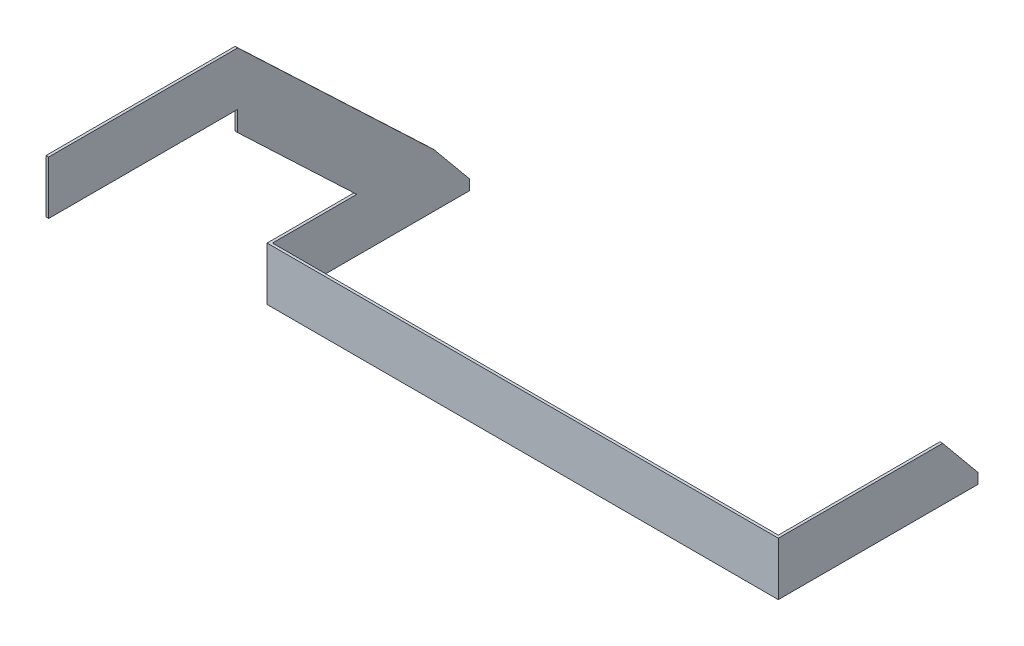
ISO-10303-21;
HEADER;
FILE_DESCRIPTION(('STEP AP214'),'2;1');
FILE_NAME('part.step','',(''),(''),'','','');
FILE_SCHEMA(('AUTOMOTIVE_DESIGN { 1 0 10303 214 1 1 1 1 }'));
ENDSEC;
DATA;
#1=APPLICATION_CONTEXT('core data for automotive mechanical design processes');
#2=APPLICATION_PROTOCOL_DEFINITION('international standard','automotive_design',2000,#1);
#3=PRODUCT_CONTEXT('',#1,'mechanical');
#4=PRODUCT('Part','Part','',(#3));
#5=PRODUCT_RELATED_PRODUCT_CATEGORY('part','',(#4));
#6=PRODUCT_DEFINITION_FORMATION('','',#4);
#7=PRODUCT_DEFINITION_CONTEXT('part definition',#1,'design');
#8=PRODUCT_DEFINITION('design','',#6,#7);
#9=PRODUCT_DEFINITION_SHAPE('','',#8);
#10=(LENGTH_UNIT() NAMED_UNIT(*) SI_UNIT(.MILLI.,.METRE.));
#11=(NAMED_UNIT(*) PLANE_ANGLE_UNIT() SI_UNIT($,.RADIAN.));
#12=(NAMED_UNIT(*) SI_UNIT($,.STERADIAN.) SOLID_ANGLE_UNIT());
#13=UNCERTAINTY_MEASURE_WITH_UNIT(LENGTH_MEASURE(1.E-05),#10,'distance_accuracy_value','');
#14=(GEOMETRIC_REPRESENTATION_CONTEXT(3) GLOBAL_UNCERTAINTY_ASSIGNED_CONTEXT((#13)) GLOBAL_UNIT_ASSIGNED_CONTEXT((#10,
#11,#12)) REPRESENTATION_CONTEXT('',''));
#15=CARTESIAN_POINT('',(0.,0.,0.));
#16=DIRECTION('',(0.,0.,1.));
#17=DIRECTION('',(1.,0.,0.));
#18=AXIS2_PLACEMENT_3D('',#15,#16,#17);
#19=CARTESIAN_POINT('',(0.,20.,0.));
#20=DIRECTION('',(0.,1.,0.));
#21=DIRECTION('',(0.,0.,1.));
#22=AXIS2_PLACEMENT_3D('',#19,#20,#21);
#23=PLANE('',#22);
#24=DIRECTION('',(-1.,0.,0.));
#25=VECTOR('',#24,1.);
#26=CARTESIAN_POINT('',(96.0000000000001,20.,-61.2196842481932));
#27=LINE('',#26,#25);
#28=CARTESIAN_POINT('',(96.0000000000001,20.,-61.2196842481932));
#29=VERTEX_POINT('',#28);
#30=CARTESIAN_POINT('',(95.0000000000001,20.,-61.2196842481932));
#31=VERTEX_POINT('',#30);
#32=EDGE_CURVE('E331',#29,#31,#27,.T.);
#33=ORIENTED_EDGE('',*,*,#32,.T.);
#34=DIRECTION('',(0.,0.,-1.));
#35=VECTOR('',#34,1.);
#36=CARTESIAN_POINT('',(95.0000000000001,20.,0.));
#37=LINE('',#36,#35);
#38=CARTESIAN_POINT('',(95.0000000000001,20.,-0.5));
#39=VERTEX_POINT('',#38);
#40=EDGE_CURVE('E224',#39,#31,#37,.T.);
#41=ORIENTED_EDGE('',*,*,#40,.F.);
#42=DIRECTION('',(1.,0.,0.));
#43=VECTOR('',#42,1.);
#44=CARTESIAN_POINT('',(0.,20.,-0.5));
#45=LINE('',#44,#43);
#46=CARTESIAN_POINT('',(-94.9999999999999,20.,-0.5));
#47=VERTEX_POINT('',#46);
#48=EDGE_CURVE('E228',#47,#39,#45,.T.);
#49=ORIENTED_EDGE('',*,*,#48,.F.);
#50=DIRECTION('',(0.,0.,-1.));
#51=VECTOR('',#50,1.);
#52=CARTESIAN_POINT('',(-94.9999999999999,20.,0.));
#53=LINE('',#52,#51);
#54=CARTESIAN_POINT('',(-94.9999999999999,20.,-32.1648908230993));
#55=VERTEX_POINT('',#54);
#56=EDGE_CURVE('E232',#47,#55,#53,.T.);
#57=ORIENTED_EDGE('',*,*,#56,.T.);
#58=DIRECTION('',(-1.,0.,0.));
#59=VECTOR('',#58,1.);
#60=CARTESIAN_POINT('',(0.,20.,-32.1648908230993));
#61=LINE('',#60,#59);
#62=CARTESIAN_POINT('',(-95.9999999999999,20.,-32.1648908230993));
#63=VERTEX_POINT('',#62);
#64=EDGE_CURVE('E205',#55,#63,#61,.T.);
#65=ORIENTED_EDGE('',*,*,#64,.T.);
#66=DIRECTION('',(0.,0.,-1.));
#67=VECTOR('',#66,1.);
#68=CARTESIAN_POINT('',(-95.9999999999999,20.,0.));
#69=LINE('',#68,#67);
#70=CARTESIAN_POINT('',(-95.9999999999999,20.,0.5));
#71=VERTEX_POINT('',#70);
#72=EDGE_CURVE('E212',#71,#63,#69,.T.);
#73=ORIENTED_EDGE('',*,*,#72,.F.);
#74=DIRECTION('',(1.,0.,0.));
#75=VECTOR('',#74,1.);
#76=CARTESIAN_POINT('',(0.,20.,0.5));
#77=LINE('',#76,#75);
#78=CARTESIAN_POINT('',(96.0000000000001,20.,0.5));
#79=VERTEX_POINT('',#78);
#80=EDGE_CURVE('E216',#71,#79,#77,.T.);
#81=ORIENTED_EDGE('',*,*,#80,.T.);
#82=DIRECTION('',(0.,0.,1.));
#83=VECTOR('',#82,1.);
#84=CARTESIAN_POINT('',(96.0000000000001,20.,0.));
#85=LINE('',#84,#83);
#86=EDGE_CURVE('E221',#29,#79,#85,.T.);
#87=ORIENTED_EDGE('',*,*,#86,.F.);
#88=EDGE_LOOP('',(#33,#41,#49,#57,#65,#73,#81,#87));
#89=FACE_BOUND('',#88,.T.);
#90=ADVANCED_FACE('F41',(#89),#23,.T.);
#91=CARTESIAN_POINT('',(-95.9999999999999,20.,0.));
#92=DIRECTION('',(-1.,0.,0.));
#93=DIRECTION('',(0.,0.,1.));
#94=AXIS2_PLACEMENT_3D('',#91,#92,#93);
#95=PLANE('',#94);
#96=DIRECTION('',(0.,0.771572940426928,0.636140863017732));
#97=VECTOR('',#96,1.);
#98=CARTESIAN_POINT('',(-95.9999999999999,20.,-61.2196842481932));
#99=LINE('',#98,#97);
#100=CARTESIAN_POINT('',(-95.9999999999999,3.89235329764689,-74.5));
#101=VERTEX_POINT('',#100);
#102=CARTESIAN_POINT('',(-95.9999999999999,20.,-61.2196842481932));
#103=VERTEX_POINT('',#102);
#104=EDGE_CURVE('E303',#101,#103,#99,.T.);
#105=ORIENTED_EDGE('',*,*,#104,.F.);
#106=DIRECTION('',(0.,-1.,0.));
#107=VECTOR('',#106,1.);
#108=CARTESIAN_POINT('',(-95.9999999999999,20.,-74.5));
#109=LINE('',#108,#107);
#110=CARTESIAN_POINT('',(-95.9999999999999,0.,-74.5));
#111=VERTEX_POINT('',#110);
#112=EDGE_CURVE('E236',#101,#111,#109,.T.);
#113=ORIENTED_EDGE('',*,*,#112,.T.);
#114=DIRECTION('',(0.,0.,-1.));
#115=VECTOR('',#114,1.);
#116=CARTESIAN_POINT('',(-95.9999999999999,0.,0.));
#117=LINE('',#116,#115);
#118=CARTESIAN_POINT('',(-95.9999999999999,0.,0.5));
#119=VERTEX_POINT('',#118);
#120=EDGE_CURVE('E211',#119,#111,#117,.T.);
#121=ORIENTED_EDGE('',*,*,#120,.F.);
#122=DIRECTION('',(0.,-1.,0.));
#123=VECTOR('',#122,1.);
#124=CARTESIAN_POINT('',(-95.9999999999999,20.,0.5));
#125=LINE('',#124,#123);
#126=EDGE_CURVE('E50',#71,#119,#125,.T.);
#127=ORIENTED_EDGE('',*,*,#126,.F.);
#128=ORIENTED_EDGE('',*,*,#72,.T.);
#129=DIRECTION('',(0.,-0.68835457569375,-0.725374371012292));
#130=VECTOR('',#129,1.);
#131=CARTESIAN_POINT('',(-95.9999999999999,26.5837645414812,-25.2270505997568));
#132=LINE('',#131,#130);
#133=CARTESIAN_POINT('',(-95.9999999999999,62.4280305463658,12.544924521475));
#134=VERTEX_POINT('',#133);
#135=EDGE_CURVE('E192',#134,#63,#132,.T.);
#136=ORIENTED_EDGE('',*,*,#135,.F.);
#137=DIRECTION('',(0.,-1.,0.));
#138=VECTOR('',#137,1.);
#139=CARTESIAN_POINT('',(-95.9999999999999,0.,12.544924521475));
#140=LINE('',#139,#138);
#141=CARTESIAN_POINT('',(-95.9999999999999,70.,12.544924521475));
#142=VERTEX_POINT('',#141);
#143=EDGE_CURVE('E195',#142,#134,#140,.T.);
#144=ORIENTED_EDGE('',*,*,#143,.F.);
#145=DIRECTION('',(0.,0.,1.));
#146=VECTOR('',#145,1.);
#147=CARTESIAN_POINT('',(-95.9999999999999,70.,12.544924521475));
#148=LINE('',#147,#146);
#149=CARTESIAN_POINT('',(-95.9999999999999,70.,83.544924521475));
#150=VERTEX_POINT('',#149);
#151=EDGE_CURVE('E57',#142,#150,#148,.T.);
#152=ORIENTED_EDGE('',*,*,#151,.T.);
#153=DIRECTION('',(0.,1.,0.));
#154=VECTOR('',#153,1.);
#155=CARTESIAN_POINT('',(-95.9999999999999,90.,83.544924521475));
#156=LINE('',#155,#154);
#157=CARTESIAN_POINT('',(-95.9999999999999,90.,83.544924521475));
#158=VERTEX_POINT('',#157);
#159=EDGE_CURVE('E356',#150,#158,#156,.T.);
#160=ORIENTED_EDGE('',*,*,#159,.T.);
#161=DIRECTION('',(0.,0.,-1.));
#162=VECTOR('',#161,1.);
#163=CARTESIAN_POINT('',(-95.9999999999999,90.,12.544924521475));
#164=LINE('',#163,#162);
#165=CARTESIAN_POINT('',(-95.9999999999999,90.,12.544924521475));
#166=VERTEX_POINT('',#165);
#167=EDGE_CURVE('E174',#158,#166,#164,.T.);
#168=ORIENTED_EDGE('',*,*,#167,.T.);
#169=DIRECTION('',(0.,0.68835457569375,0.725374371012292));
#170=VECTOR('',#169,1.);
#171=CARTESIAN_POINT('',(-95.9999999999999,41.0912519617271,-38.9941421136318));
#172=LINE('',#171,#170);
#173=EDGE_CURVE('E188',#103,#166,#172,.T.);
#174=ORIENTED_EDGE('',*,*,#173,.F.);
#175=EDGE_LOOP('',(#105,#113,#121,#127,#128,#136,#144,#152,#160,#168,#174));
#176=FACE_BOUND('',#175,.T.);
#177=ADVANCED_FACE('F43',(#176),#95,.T.);
#178=CARTESIAN_POINT('',(0.,20.,0.5));
#179=DIRECTION('',(0.,0.,-1.));
#180=DIRECTION('',(-1.,0.,0.));
#181=AXIS2_PLACEMENT_3D('',#178,#179,#180);
#182=PLANE('',#181);
#183=DIRECTION('',(1.,0.,0.));
#184=VECTOR('',#183,1.);
#185=CARTESIAN_POINT('',(0.,0.,0.5));
#186=LINE('',#185,#184);
#187=CARTESIAN_POINT('',(96.0000000000001,0.,0.5));
#188=VERTEX_POINT('',#187);
#189=EDGE_CURVE('E240',#119,#188,#186,.T.);
#190=ORIENTED_EDGE('',*,*,#189,.T.);
#191=DIRECTION('',(0.,-1.,0.));
#192=VECTOR('',#191,1.);
#193=CARTESIAN_POINT('',(96.0000000000001,20.,0.5));
#194=LINE('',#193,#192);
#195=EDGE_CURVE('E284',#79,#188,#194,.T.);
#196=ORIENTED_EDGE('',*,*,#195,.F.);
#197=ORIENTED_EDGE('',*,*,#80,.F.);
#198=ORIENTED_EDGE('',*,*,#126,.T.);
#199=EDGE_LOOP('',(#190,#196,#197,#198));
#200=FACE_BOUND('',#199,.T.);
#201=ADVANCED_FACE('F290',(#200),#182,.F.);
#202=CARTESIAN_POINT('',(96.0000000000001,20.,0.));
#203=DIRECTION('',(1.,0.,0.));
#204=DIRECTION('',(0.,0.,-1.));
#205=AXIS2_PLACEMENT_3D('',#202,#203,#204);
#206=PLANE('',#205);
#207=DIRECTION('',(0.,0.771572940426928,0.636140863017732));
#208=VECTOR('',#207,1.);
#209=CARTESIAN_POINT('',(96.0000000000001,20.,-61.2196842481932));
#210=LINE('',#209,#208);
#211=CARTESIAN_POINT('',(96.0000000000001,3.89235329764689,-74.5));
#212=VERTEX_POINT('',#211);
#213=EDGE_CURVE('E325',#212,#29,#210,.T.);
#214=ORIENTED_EDGE('',*,*,#213,.T.);
#215=ORIENTED_EDGE('',*,*,#86,.T.);
#216=ORIENTED_EDGE('',*,*,#195,.T.);
#217=DIRECTION('',(0.,0.,1.));
#218=VECTOR('',#217,1.);
#219=CARTESIAN_POINT('',(96.0000000000001,0.,0.));
#220=LINE('',#219,#218);
#221=CARTESIAN_POINT('',(96.0000000000001,0.,-74.5));
#222=VERTEX_POINT('',#221);
#223=EDGE_CURVE('E244',#222,#188,#220,.T.);
#224=ORIENTED_EDGE('',*,*,#223,.F.);
#225=DIRECTION('',(0.,-1.,0.));
#226=VECTOR('',#225,1.);
#227=CARTESIAN_POINT('',(96.0000000000001,20.,-74.5));
#228=LINE('',#227,#226);
#229=EDGE_CURVE('E281',#212,#222,#228,.T.);
#230=ORIENTED_EDGE('',*,*,#229,.F.);
#231=EDGE_LOOP('',(#214,#215,#216,#224,#230));
#232=FACE_BOUND('',#231,.T.);
#233=ADVANCED_FACE('F323',(#232),#206,.T.);
#234=CARTESIAN_POINT('',(0.,20.,-74.5));
#235=DIRECTION('',(0.,0.,1.));
#236=DIRECTION('',(1.,0.,0.));
#237=AXIS2_PLACEMENT_3D('',#234,#235,#236);
#238=PLANE('',#237);
#239=DIRECTION('',(0.,-1.,0.));
#240=VECTOR('',#239,1.);
#241=CARTESIAN_POINT('',(95.0000000000001,20.,-74.5));
#242=LINE('',#241,#240);
#243=CARTESIAN_POINT('',(95.0000000000001,3.89235329764689,-74.5));
#244=VERTEX_POINT('',#243);
#245=CARTESIAN_POINT('',(95.0000000000001,0.,-74.5));
#246=VERTEX_POINT('',#245);
#247=EDGE_CURVE('E278',#244,#246,#242,.T.);
#248=ORIENTED_EDGE('',*,*,#247,.F.);
#249=DIRECTION('',(-1.,0.,0.));
#250=VECTOR('',#249,1.);
#251=CARTESIAN_POINT('',(96.0000000000001,3.89235329764689,-74.5));
#252=LINE('',#251,#250);
#253=EDGE_CURVE('E65',#212,#244,#252,.T.);
#254=ORIENTED_EDGE('',*,*,#253,.F.);
#255=ORIENTED_EDGE('',*,*,#229,.T.);
#256=DIRECTION('',(-1.,0.,0.));
#257=VECTOR('',#256,1.);
#258=CARTESIAN_POINT('',(0.,0.,-74.5));
#259=LINE('',#258,#257);
#260=EDGE_CURVE('E248',#222,#246,#259,.T.);
#261=ORIENTED_EDGE('',*,*,#260,.T.);
#262=EDGE_LOOP('',(#248,#254,#255,#261));
#263=FACE_BOUND('',#262,.T.);
#264=ADVANCED_FACE('F334',(#263),#238,.F.);
#265=CARTESIAN_POINT('',(95.0000000000001,20.,0.));
#266=DIRECTION('',(-1.,0.,0.));
#267=DIRECTION('',(0.,0.,1.));
#268=AXIS2_PLACEMENT_3D('',#265,#266,#267);
#269=PLANE('',#268);
#270=DIRECTION('',(0.,0.771572940426928,0.636140863017732));
#271=VECTOR('',#270,1.);
#272=CARTESIAN_POINT('',(95.0000000000001,50.0484010650605,-36.4455964279882));
#273=LINE('',#272,#271);
#274=EDGE_CURVE('E196',#244,#31,#273,.T.);
#275=ORIENTED_EDGE('',*,*,#274,.F.);
#276=ORIENTED_EDGE('',*,*,#247,.T.);
#277=DIRECTION('',(0.,0.,-1.));
#278=VECTOR('',#277,1.);
#279=CARTESIAN_POINT('',(95.0000000000001,0.,0.));
#280=LINE('',#279,#278);
#281=CARTESIAN_POINT('',(95.0000000000001,0.,-0.5));
#282=VERTEX_POINT('',#281);
#283=EDGE_CURVE('E252',#282,#246,#280,.T.);
#284=ORIENTED_EDGE('',*,*,#283,.F.);
#285=DIRECTION('',(0.,-1.,0.));
#286=VECTOR('',#285,1.);
#287=CARTESIAN_POINT('',(95.0000000000001,20.,-0.5));
#288=LINE('',#287,#286);
#289=EDGE_CURVE('E275',#39,#282,#288,.T.);
#290=ORIENTED_EDGE('',*,*,#289,.F.);
#291=ORIENTED_EDGE('',*,*,#40,.T.);
#292=EDGE_LOOP('',(#275,#276,#284,#290,#291));
#293=FACE_BOUND('',#292,.T.);
#294=ADVANCED_FACE('F317',(#293),#269,.T.);
#295=CARTESIAN_POINT('',(0.,20.,-0.5));
#296=DIRECTION('',(0.,0.,-1.));
#297=DIRECTION('',(-1.,0.,0.));
#298=AXIS2_PLACEMENT_3D('',#295,#296,#297);
#299=PLANE('',#298);
#300=DIRECTION('',(1.,0.,0.));
#301=VECTOR('',#300,1.);
#302=CARTESIAN_POINT('',(0.,0.,-0.5));
#303=LINE('',#302,#301);
#304=CARTESIAN_POINT('',(-94.9999999999999,0.,-0.5));
#305=VERTEX_POINT('',#304);
#306=EDGE_CURVE('E256',#305,#282,#303,.T.);
#307=ORIENTED_EDGE('',*,*,#306,.F.);
#308=DIRECTION('',(0.,-1.,0.));
#309=VECTOR('',#308,1.);
#310=CARTESIAN_POINT('',(-94.9999999999999,20.,-0.5));
#311=LINE('',#310,#309);
#312=EDGE_CURVE('E272',#47,#305,#311,.T.);
#313=ORIENTED_EDGE('',*,*,#312,.F.);
#314=ORIENTED_EDGE('',*,*,#48,.T.);
#315=ORIENTED_EDGE('',*,*,#289,.T.);
#316=EDGE_LOOP('',(#307,#313,#314,#315));
#317=FACE_BOUND('',#316,.T.);
#318=ADVANCED_FACE('F311',(#317),#299,.T.);
#319=CARTESIAN_POINT('',(-94.9999999999999,20.,0.));
#320=DIRECTION('',(-1.,0.,0.));
#321=DIRECTION('',(0.,0.,1.));
#322=AXIS2_PLACEMENT_3D('',#319,#320,#321);
#323=PLANE('',#322);
#324=DIRECTION('',(0.,-1.,0.));
#325=VECTOR('',#324,1.);
#326=CARTESIAN_POINT('',(-94.9999999999999,20.,-74.5));
#327=LINE('',#326,#325);
#328=CARTESIAN_POINT('',(-94.9999999999999,3.89235329764689,-74.5));
#329=VERTEX_POINT('',#328);
#330=CARTESIAN_POINT('',(-94.9999999999999,0.,-74.5));
#331=VERTEX_POINT('',#330);
#332=EDGE_CURVE('E269',#329,#331,#327,.T.);
#333=ORIENTED_EDGE('',*,*,#332,.F.);
#334=DIRECTION('',(0.,0.771572940426928,0.636140863017732));
#335=VECTOR('',#334,1.);
#336=CARTESIAN_POINT('',(-94.9999999999999,50.0484010650605,-36.4455964279882));
#337=LINE('',#336,#335);
#338=CARTESIAN_POINT('',(-94.9999999999999,20.,-61.2196842481932));
#339=VERTEX_POINT('',#338);
#340=EDGE_CURVE('E333',#329,#339,#337,.T.);
#341=ORIENTED_EDGE('',*,*,#340,.T.);
#342=DIRECTION('',(0.,0.68835457569375,0.725374371012292));
#343=VECTOR('',#342,1.);
#344=CARTESIAN_POINT('',(-94.9999999999999,41.0912519617271,-38.9941421136318));
#345=LINE('',#344,#343);
#346=CARTESIAN_POINT('',(-94.9999999999999,90.,12.544924521475));
#347=VERTEX_POINT('',#346);
#348=EDGE_CURVE('E181',#339,#347,#345,.T.);
#349=ORIENTED_EDGE('',*,*,#348,.T.);
#350=DIRECTION('',(0.,0.,-1.));
#351=VECTOR('',#350,1.);
#352=CARTESIAN_POINT('',(-94.9999999999999,90.,12.544924521475));
#353=LINE('',#352,#351);
#354=CARTESIAN_POINT('',(-94.9999999999999,90.,83.544924521475));
#355=VERTEX_POINT('',#354);
#356=EDGE_CURVE('E161',#355,#347,#353,.T.);
#357=ORIENTED_EDGE('',*,*,#356,.F.);
#358=DIRECTION('',(0.,1.,0.));
#359=VECTOR('',#358,1.);
#360=CARTESIAN_POINT('',(-94.9999999999999,90.,83.544924521475));
#361=LINE('',#360,#359);
#362=CARTESIAN_POINT('',(-94.9999999999999,70.,83.544924521475));
#363=VERTEX_POINT('',#362);
#364=EDGE_CURVE('E172',#363,#355,#361,.T.);
#365=ORIENTED_EDGE('',*,*,#364,.F.);
#366=DIRECTION('',(0.,0.,1.));
#367=VECTOR('',#366,1.);
#368=CARTESIAN_POINT('',(-94.9999999999999,70.,12.544924521475));
#369=LINE('',#368,#367);
#370=CARTESIAN_POINT('',(-94.9999999999999,70.,12.544924521475));
#371=VERTEX_POINT('',#370);
#372=EDGE_CURVE('E155',#371,#363,#369,.T.);
#373=ORIENTED_EDGE('',*,*,#372,.F.);
#374=DIRECTION('',(0.,-1.,0.));
#375=VECTOR('',#374,1.);
#376=CARTESIAN_POINT('',(-94.9999999999999,0.,12.544924521475));
#377=LINE('',#376,#375);
#378=CARTESIAN_POINT('',(-94.9999999999999,62.4280305463658,12.544924521475));
#379=VERTEX_POINT('',#378);
#380=EDGE_CURVE('E168',#371,#379,#377,.T.);
#381=ORIENTED_EDGE('',*,*,#380,.T.);
#382=DIRECTION('',(0.,-0.68835457569375,-0.725374371012292));
#383=VECTOR('',#382,1.);
#384=CARTESIAN_POINT('',(-94.9999999999999,26.5837645414812,-25.2270505997568));
#385=LINE('',#384,#383);
#386=EDGE_CURVE('E182',#379,#55,#385,.T.);
#387=ORIENTED_EDGE('',*,*,#386,.T.);
#388=ORIENTED_EDGE('',*,*,#56,.F.);
#389=ORIENTED_EDGE('',*,*,#312,.T.);
#390=DIRECTION('',(0.,0.,-1.));
#391=VECTOR('',#390,1.);
#392=CARTESIAN_POINT('',(-94.9999999999999,0.,0.));
#393=LINE('',#392,#391);
#394=EDGE_CURVE('E260',#305,#331,#393,.T.);
#395=ORIENTED_EDGE('',*,*,#394,.T.);
#396=EDGE_LOOP('',(#333,#341,#349,#357,#365,#373,#381,#387,#388,#389,#395));
#397=FACE_BOUND('',#396,.T.);
#398=ADVANCED_FACE('F166',(#397),#323,.F.);
#399=CARTESIAN_POINT('',(0.,20.,-74.5));
#400=DIRECTION('',(0.,0.,-1.));
#401=DIRECTION('',(-1.,0.,0.));
#402=AXIS2_PLACEMENT_3D('',#399,#400,#401);
#403=PLANE('',#402);
#404=EDGE_CURVE('E307',#329,#101,#252,.T.);
#405=ORIENTED_EDGE('',*,*,#404,.F.);
#406=ORIENTED_EDGE('',*,*,#332,.T.);
#407=DIRECTION('',(1.,0.,0.));
#408=VECTOR('',#407,1.);
#409=CARTESIAN_POINT('',(0.,0.,-74.5));
#410=LINE('',#409,#408);
#411=EDGE_CURVE('E217',#111,#331,#410,.T.);
#412=ORIENTED_EDGE('',*,*,#411,.F.);
#413=ORIENTED_EDGE('',*,*,#112,.F.);
#414=EDGE_LOOP('',(#405,#406,#412,#413));
#415=FACE_BOUND('',#414,.T.);
#416=ADVANCED_FACE('F306',(#415),#403,.T.);
#417=CARTESIAN_POINT('',(0.,0.,0.));
#418=DIRECTION('',(0.,1.,0.));
#419=DIRECTION('',(0.,0.,1.));
#420=AXIS2_PLACEMENT_3D('',#417,#418,#419);
#421=PLANE('',#420);
#422=ORIENTED_EDGE('',*,*,#411,.T.);
#423=ORIENTED_EDGE('',*,*,#394,.F.);
#424=ORIENTED_EDGE('',*,*,#306,.T.);
#425=ORIENTED_EDGE('',*,*,#283,.T.);
#426=ORIENTED_EDGE('',*,*,#260,.F.);
#427=ORIENTED_EDGE('',*,*,#223,.T.);
#428=ORIENTED_EDGE('',*,*,#189,.F.);
#429=ORIENTED_EDGE('',*,*,#120,.T.);
#430=EDGE_LOOP('',(#422,#423,#424,#425,#426,#427,#428,#429));
#431=FACE_BOUND('',#430,.T.);
#432=ADVANCED_FACE('F296',(#431),#421,.F.);
#433=CARTESIAN_POINT('',(-94.9999999999999,26.5837645414812,-25.2270505997568));
#434=DIRECTION('',(0.,0.725374371012292,-0.68835457569375));
#435=DIRECTION('',(0.,0.68835457569375,0.725374371012292));
#436=AXIS2_PLACEMENT_3D('',#433,#434,#435);
#437=PLANE('',#436);
#438=ORIENTED_EDGE('',*,*,#64,.F.);
#439=ORIENTED_EDGE('',*,*,#386,.F.);
#440=DIRECTION('',(-1.,0.,0.));
#441=VECTOR('',#440,1.);
#442=CARTESIAN_POINT('',(-94.9999999999999,62.4280305463658,12.544924521475));
#443=LINE('',#442,#441);
#444=EDGE_CURVE('E178',#379,#134,#443,.T.);
#445=ORIENTED_EDGE('',*,*,#444,.T.);
#446=ORIENTED_EDGE('',*,*,#135,.T.);
#447=EDGE_LOOP('',(#438,#439,#445,#446));
#448=FACE_BOUND('',#447,.T.);
#449=ADVANCED_FACE('F330',(#448),#437,.F.);
#450=CARTESIAN_POINT('',(-94.9999999999999,41.0912519617271,-38.9941421136318));
#451=DIRECTION('',(0.,-0.725374371012292,0.68835457569375));
#452=DIRECTION('',(0.,-0.68835457569375,-0.725374371012292));
#453=AXIS2_PLACEMENT_3D('',#450,#451,#452);
#454=PLANE('',#453);
#455=DIRECTION('',(1.,0.,0.));
#456=VECTOR('',#455,1.);
#457=CARTESIAN_POINT('',(0.,20.,-61.2196842481932));
#458=LINE('',#457,#456);
#459=EDGE_CURVE('E11',#103,#339,#458,.T.);
#460=ORIENTED_EDGE('',*,*,#459,.F.);
#461=ORIENTED_EDGE('',*,*,#173,.T.);
#462=DIRECTION('',(-1.,0.,0.));
#463=VECTOR('',#462,1.);
#464=CARTESIAN_POINT('',(-94.9999999999999,90.,12.544924521475));
#465=LINE('',#464,#463);
#466=EDGE_CURVE('E202',#347,#166,#465,.T.);
#467=ORIENTED_EDGE('',*,*,#466,.F.);
#468=ORIENTED_EDGE('',*,*,#348,.F.);
#469=EDGE_LOOP('',(#460,#461,#467,#468));
#470=FACE_BOUND('',#469,.T.);
#471=ADVANCED_FACE('F349',(#470),#454,.F.);
#472=CARTESIAN_POINT('',(-94.9999999999999,0.,12.544924521475));
#473=DIRECTION('',(0.,0.,-1.));
#474=DIRECTION('',(0.,1.,0.));
#475=AXIS2_PLACEMENT_3D('',#472,#473,#474);
#476=PLANE('',#475);
#477=ORIENTED_EDGE('',*,*,#380,.F.);
#478=DIRECTION('',(-1.,0.,0.));
#479=VECTOR('',#478,1.);
#480=CARTESIAN_POINT('',(-94.9999999999999,70.,12.544924521475));
#481=LINE('',#480,#479);
#482=EDGE_CURVE('E152',#371,#142,#481,.T.);
#483=ORIENTED_EDGE('',*,*,#482,.T.);
#484=ORIENTED_EDGE('',*,*,#143,.T.);
#485=ORIENTED_EDGE('',*,*,#444,.F.);
#486=EDGE_LOOP('',(#477,#483,#484,#485));
#487=FACE_BOUND('',#486,.T.);
#488=ADVANCED_FACE('F176',(#487),#476,.F.);
#489=CARTESIAN_POINT('',(96.0000000000001,20.,-61.2196842481932));
#490=DIRECTION('',(0.,-0.636140863017732,0.771572940426928));
#491=DIRECTION('',(0.,-0.771572940426928,-0.636140863017732));
#492=AXIS2_PLACEMENT_3D('',#489,#490,#491);
#493=PLANE('',#492);
#494=ORIENTED_EDGE('',*,*,#404,.T.);
#495=ORIENTED_EDGE('',*,*,#104,.T.);
#496=ORIENTED_EDGE('',*,*,#459,.T.);
#497=ORIENTED_EDGE('',*,*,#340,.F.);
#498=EDGE_LOOP('',(#494,#495,#496,#497));
#499=FACE_BOUND('',#498,.T.);
#500=ADVANCED_FACE('F370',(#499),#493,.F.);
#501=ORIENTED_EDGE('',*,*,#274,.T.);
#502=ORIENTED_EDGE('',*,*,#32,.F.);
#503=ORIENTED_EDGE('',*,*,#213,.F.);
#504=ORIENTED_EDGE('',*,*,#253,.T.);
#505=EDGE_LOOP('',(#501,#502,#503,#504));
#506=FACE_BOUND('',#505,.T.);
#507=ADVANCED_FACE('F372',(#506),#493,.F.);
#508=CARTESIAN_POINT('',(-94.9999999999999,90.,12.544924521475));
#509=DIRECTION('',(0.,1.,0.));
#510=DIRECTION('',(0.,0.,1.));
#511=AXIS2_PLACEMENT_3D('',#508,#509,#510);
#512=PLANE('',#511);
#513=ORIENTED_EDGE('',*,*,#167,.F.);
#514=DIRECTION('',(-1.,0.,0.));
#515=VECTOR('',#514,1.);
#516=CARTESIAN_POINT('',(-94.9999999999999,90.,83.544924521475));
#517=LINE('',#516,#515);
#518=EDGE_CURVE('E363',#355,#158,#517,.T.);
#519=ORIENTED_EDGE('',*,*,#518,.F.);
#520=ORIENTED_EDGE('',*,*,#356,.T.);
#521=ORIENTED_EDGE('',*,*,#466,.T.);
#522=EDGE_LOOP('',(#513,#519,#520,#521));
#523=FACE_BOUND('',#522,.T.);
#524=ADVANCED_FACE('F353',(#523),#512,.T.);
#525=CARTESIAN_POINT('',(-94.9999999999999,90.,83.544924521475));
#526=DIRECTION('',(0.,0.,1.));
#527=DIRECTION('',(1.,0.,0.));
#528=AXIS2_PLACEMENT_3D('',#525,#526,#527);
#529=PLANE('',#528);
#530=ORIENTED_EDGE('',*,*,#159,.F.);
#531=DIRECTION('',(-1.,0.,0.));
#532=VECTOR('',#531,1.);
#533=CARTESIAN_POINT('',(-94.9999999999999,70.,83.544924521475));
#534=LINE('',#533,#532);
#535=EDGE_CURVE('E160',#363,#150,#534,.T.);
#536=ORIENTED_EDGE('',*,*,#535,.F.);
#537=ORIENTED_EDGE('',*,*,#364,.T.);
#538=ORIENTED_EDGE('',*,*,#518,.T.);
#539=EDGE_LOOP('',(#530,#536,#537,#538));
#540=FACE_BOUND('',#539,.T.);
#541=ADVANCED_FACE('F458',(#540),#529,.T.);
#542=CARTESIAN_POINT('',(-94.9999999999999,70.,12.544924521475));
#543=DIRECTION('',(0.,-1.,0.));
#544=DIRECTION('',(0.,0.,-1.));
#545=AXIS2_PLACEMENT_3D('',#542,#543,#544);
#546=PLANE('',#545);
#547=ORIENTED_EDGE('',*,*,#151,.F.);
#548=ORIENTED_EDGE('',*,*,#482,.F.);
#549=ORIENTED_EDGE('',*,*,#372,.T.);
#550=ORIENTED_EDGE('',*,*,#535,.T.);
#551=EDGE_LOOP('',(#547,#548,#549,#550));
#552=FACE_BOUND('',#551,.T.);
#553=ADVANCED_FACE('F154',(#552),#546,.T.);
#554=CLOSED_SHELL('',(#90,#177,#201,#233,#264,#294,#318,#398,#416,#432,#449,#471,#488,#500,#507,
#524,#541,#553));
#555=MANIFOLD_SOLID_BREP('B2',#554);
#556=ADVANCED_BREP_SHAPE_REPRESENTATION('',(#18,#555),#14);
#557=SHAPE_DEFINITION_REPRESENTATION(#9,#556);
ENDSEC;
END-ISO-10303-21;
